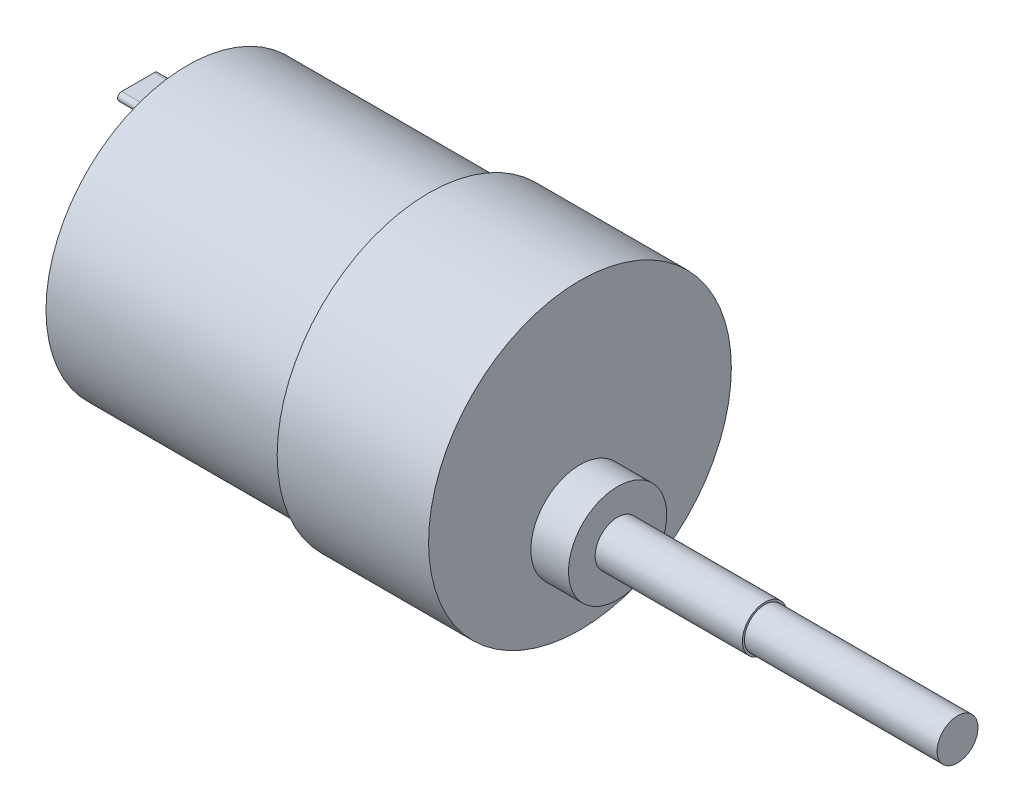
ISO-10303-21;
HEADER;
FILE_DESCRIPTION(('STEP AP214'),'2;1');
FILE_NAME('part.step','',(''),(''),'','','');
FILE_SCHEMA(('AUTOMOTIVE_DESIGN { 1 0 10303 214 1 1 1 1 }'));
ENDSEC;
DATA;
#1=APPLICATION_CONTEXT('core data for automotive mechanical design processes');
#2=APPLICATION_PROTOCOL_DEFINITION('international standard','automotive_design',2000,#1);
#3=PRODUCT_CONTEXT('',#1,'mechanical');
#4=PRODUCT('Part','Part','',(#3));
#5=PRODUCT_RELATED_PRODUCT_CATEGORY('part','',(#4));
#6=PRODUCT_DEFINITION_FORMATION('','',#4);
#7=PRODUCT_DEFINITION_CONTEXT('part definition',#1,'design');
#8=PRODUCT_DEFINITION('design','',#6,#7);
#9=PRODUCT_DEFINITION_SHAPE('','',#8);
#10=(LENGTH_UNIT() NAMED_UNIT(*) SI_UNIT(.MILLI.,.METRE.));
#11=(NAMED_UNIT(*) PLANE_ANGLE_UNIT() SI_UNIT($,.RADIAN.));
#12=(NAMED_UNIT(*) SI_UNIT($,.STERADIAN.) SOLID_ANGLE_UNIT());
#13=UNCERTAINTY_MEASURE_WITH_UNIT(LENGTH_MEASURE(1.E-05),#10,'distance_accuracy_value','');
#14=(GEOMETRIC_REPRESENTATION_CONTEXT(3) GLOBAL_UNCERTAINTY_ASSIGNED_CONTEXT((#13)) GLOBAL_UNIT_ASSIGNED_CONTEXT((#10,
#11,#12)) REPRESENTATION_CONTEXT('',''));
#15=CARTESIAN_POINT('',(0.,0.,0.));
#16=DIRECTION('',(0.,0.,1.));
#17=DIRECTION('',(1.,0.,0.));
#18=AXIS2_PLACEMENT_3D('',#15,#16,#17);
#19=CARTESIAN_POINT('',(0.,0.,0.));
#20=DIRECTION('',(1.,0.,0.));
#21=DIRECTION('',(0.,0.,-1.));
#22=AXIS2_PLACEMENT_3D('',#19,#20,#21);
#23=PLANE('',#22);
#24=CARTESIAN_POINT('',(0.,12.,-2.));
#25=DIRECTION('',(-1.,0.,0.));
#26=DIRECTION('',(0.,0.,1.));
#27=AXIS2_PLACEMENT_3D('',#24,#25,#26);
#28=CIRCLE('',#27,0.499999999999999);
#29=CARTESIAN_POINT('',(0.,12.5,-2.));
#30=VERTEX_POINT('',#29);
#31=CARTESIAN_POINT('',(0.,11.5,-2.));
#32=VERTEX_POINT('',#31);
#33=EDGE_CURVE('E128',#30,#32,#28,.T.);
#34=ORIENTED_EDGE('',*,*,#33,.F.);
#35=DIRECTION('',(0.,0.,-1.));
#36=VECTOR('',#35,1.);
#37=CARTESIAN_POINT('',(0.,12.5,-2.));
#38=LINE('',#37,#36);
#39=CARTESIAN_POINT('',(0.,12.5,2.));
#40=VERTEX_POINT('',#39);
#41=EDGE_CURVE('E171',#40,#30,#38,.T.);
#42=ORIENTED_EDGE('',*,*,#41,.F.);
#43=CARTESIAN_POINT('',(0.,12.,2.));
#44=DIRECTION('',(-1.,0.,0.));
#45=DIRECTION('',(0.,0.,1.));
#46=AXIS2_PLACEMENT_3D('',#43,#44,#45);
#47=CIRCLE('',#46,0.499999999999999);
#48=CARTESIAN_POINT('',(0.,11.5,2.));
#49=VERTEX_POINT('',#48);
#50=EDGE_CURVE('E188',#49,#40,#47,.T.);
#51=ORIENTED_EDGE('',*,*,#50,.F.);
#52=DIRECTION('',(0.,0.,1.));
#53=VECTOR('',#52,1.);
#54=CARTESIAN_POINT('',(0.,11.5,-2.));
#55=LINE('',#54,#53);
#56=EDGE_CURVE('E184',#32,#49,#55,.T.);
#57=ORIENTED_EDGE('',*,*,#56,.F.);
#58=EDGE_LOOP('',(#34,#42,#51,#57));
#59=FACE_BOUND('',#58,.T.);
#60=CARTESIAN_POINT('',(0.,0.,0.));
#61=DIRECTION('',(-1.,0.,0.));
#62=DIRECTION('',(0.,0.,1.));
#63=AXIS2_PLACEMENT_3D('',#60,#61,#62);
#64=CIRCLE('',#63,3.);
#65=CARTESIAN_POINT('',(0.,0.,3.));
#66=VERTEX_POINT('',#65);
#67=EDGE_CURVE('E219',#66,#66,#64,.T.);
#68=ORIENTED_EDGE('',*,*,#67,.F.);
#69=EDGE_LOOP('',(#68));
#70=FACE_BOUND('',#69,.T.);
#71=CARTESIAN_POINT('',(0.,0.,0.));
#72=DIRECTION('',(1.,0.,0.));
#73=DIRECTION('',(0.,0.,-1.));
#74=AXIS2_PLACEMENT_3D('',#71,#72,#73);
#75=CIRCLE('',#74,17.25);
#76=CARTESIAN_POINT('',(0.,0.,-17.25));
#77=VERTEX_POINT('',#76);
#78=EDGE_CURVE('E53',#77,#77,#75,.T.);
#79=ORIENTED_EDGE('',*,*,#78,.F.);
#80=EDGE_LOOP('',(#79));
#81=FACE_BOUND('',#80,.T.);
#82=CARTESIAN_POINT('',(0.,-12.,-2.));
#83=DIRECTION('',(-1.,0.,0.));
#84=DIRECTION('',(0.,0.,-1.));
#85=AXIS2_PLACEMENT_3D('',#82,#83,#84);
#86=CIRCLE('',#85,0.499999999999999);
#87=CARTESIAN_POINT('',(0.,-11.5,-2.));
#88=VERTEX_POINT('',#87);
#89=CARTESIAN_POINT('',(0.,-12.5,-2.));
#90=VERTEX_POINT('',#89);
#91=EDGE_CURVE('E121',#88,#90,#86,.T.);
#92=ORIENTED_EDGE('',*,*,#91,.F.);
#93=DIRECTION('',(0.,0.,-1.));
#94=VECTOR('',#93,1.);
#95=CARTESIAN_POINT('',(0.,-11.5,-2.));
#96=LINE('',#95,#94);
#97=CARTESIAN_POINT('',(0.,-11.5,2.));
#98=VERTEX_POINT('',#97);
#99=EDGE_CURVE('E123',#98,#88,#96,.T.);
#100=ORIENTED_EDGE('',*,*,#99,.F.);
#101=CARTESIAN_POINT('',(0.,-12.,2.));
#102=DIRECTION('',(-1.,0.,0.));
#103=DIRECTION('',(0.,0.,-1.));
#104=AXIS2_PLACEMENT_3D('',#101,#102,#103);
#105=CIRCLE('',#104,0.499999999999999);
#106=CARTESIAN_POINT('',(0.,-12.5,2.));
#107=VERTEX_POINT('',#106);
#108=EDGE_CURVE('E77',#107,#98,#105,.T.);
#109=ORIENTED_EDGE('',*,*,#108,.F.);
#110=DIRECTION('',(0.,0.,1.));
#111=VECTOR('',#110,1.);
#112=CARTESIAN_POINT('',(0.,-12.5,-2.));
#113=LINE('',#112,#111);
#114=EDGE_CURVE('E70',#90,#107,#113,.T.);
#115=ORIENTED_EDGE('',*,*,#114,.F.);
#116=EDGE_LOOP('',(#92,#100,#109,#115));
#117=FACE_BOUND('',#116,.T.);
#118=ADVANCED_FACE('F49',(#59,#70,#81,#117),#23,.F.);
#119=CARTESIAN_POINT('',(29.5,0.,0.));
#120=DIRECTION('',(-1.,0.,0.));
#121=DIRECTION('',(0.,0.,1.));
#122=AXIS2_PLACEMENT_3D('',#119,#120,#121);
#123=CYLINDRICAL_SURFACE('',#122,17.25);
#124=CARTESIAN_POINT('',(29.5,0.,0.));
#125=DIRECTION('',(1.,0.,0.));
#126=DIRECTION('',(0.,0.,-1.));
#127=AXIS2_PLACEMENT_3D('',#124,#125,#126);
#128=CIRCLE('',#127,17.25);
#129=CARTESIAN_POINT('',(29.5,0.,-17.25));
#130=VERTEX_POINT('',#129);
#131=EDGE_CURVE('E227',#130,#130,#128,.T.);
#132=ORIENTED_EDGE('',*,*,#131,.F.);
#133=EDGE_LOOP('',(#132));
#134=FACE_BOUND('',#133,.T.);
#135=ORIENTED_EDGE('',*,*,#78,.T.);
#136=EDGE_LOOP('',(#135));
#137=FACE_BOUND('',#136,.T.);
#138=ADVANCED_FACE('F51',(#134,#137),#123,.T.);
#139=CARTESIAN_POINT('',(48.,0.,0.));
#140=DIRECTION('',(-1.,0.,0.));
#141=DIRECTION('',(0.,0.,1.));
#142=AXIS2_PLACEMENT_3D('',#139,#140,#141);
#143=CYLINDRICAL_SURFACE('',#142,18.5);
#144=CARTESIAN_POINT('',(48.,0.,0.));
#145=DIRECTION('',(1.,0.,0.));
#146=DIRECTION('',(0.,0.,-1.));
#147=AXIS2_PLACEMENT_3D('',#144,#145,#146);
#148=CIRCLE('',#147,18.5);
#149=CARTESIAN_POINT('',(48.,0.,-18.5));
#150=VERTEX_POINT('',#149);
#151=EDGE_CURVE('E228',#150,#150,#148,.T.);
#152=ORIENTED_EDGE('',*,*,#151,.F.);
#153=EDGE_LOOP('',(#152));
#154=FACE_BOUND('',#153,.T.);
#155=CARTESIAN_POINT('',(29.5,0.,0.));
#156=DIRECTION('',(1.,0.,0.));
#157=DIRECTION('',(0.,0.,-1.));
#158=AXIS2_PLACEMENT_3D('',#155,#156,#157);
#159=CIRCLE('',#158,18.5);
#160=CARTESIAN_POINT('',(29.5,0.,-18.5));
#161=VERTEX_POINT('',#160);
#162=EDGE_CURVE('E223',#161,#161,#159,.T.);
#163=ORIENTED_EDGE('',*,*,#162,.T.);
#164=EDGE_LOOP('',(#163));
#165=FACE_BOUND('',#164,.T.);
#166=ADVANCED_FACE('F248',(#154,#165),#143,.T.);
#167=CARTESIAN_POINT('',(48.,0.,0.));
#168=DIRECTION('',(1.,0.,0.));
#169=DIRECTION('',(0.,0.,-1.));
#170=AXIS2_PLACEMENT_3D('',#167,#168,#169);
#171=PLANE('',#170);
#172=CARTESIAN_POINT('',(48.,-7.,0.));
#173=DIRECTION('',(1.,0.,0.));
#174=DIRECTION('',(0.,0.,-1.));
#175=AXIS2_PLACEMENT_3D('',#172,#173,#174);
#176=CIRCLE('',#175,6.);
#177=CARTESIAN_POINT('',(48.,-7.,-6.));
#178=VERTEX_POINT('',#177);
#179=EDGE_CURVE('E346',#178,#178,#176,.T.);
#180=ORIENTED_EDGE('',*,*,#179,.F.);
#181=EDGE_LOOP('',(#180));
#182=FACE_BOUND('',#181,.T.);
#183=ORIENTED_EDGE('',*,*,#151,.T.);
#184=EDGE_LOOP('',(#183));
#185=FACE_BOUND('',#184,.T.);
#186=ADVANCED_FACE('F253',(#182,#185),#171,.T.);
#187=CARTESIAN_POINT('',(29.5,0.,0.));
#188=DIRECTION('',(1.,0.,0.));
#189=DIRECTION('',(0.,0.,-1.));
#190=AXIS2_PLACEMENT_3D('',#187,#188,#189);
#191=PLANE('',#190);
#192=ORIENTED_EDGE('',*,*,#131,.T.);
#193=EDGE_LOOP('',(#192));
#194=FACE_BOUND('',#193,.T.);
#195=ORIENTED_EDGE('',*,*,#162,.F.);
#196=EDGE_LOOP('',(#195));
#197=FACE_BOUND('',#196,.T.);
#198=ADVANCED_FACE('F255',(#194,#197),#191,.F.);
#199=CARTESIAN_POINT('',(-1.5,0.,0.));
#200=DIRECTION('',(1.,0.,0.));
#201=DIRECTION('',(0.,0.,-1.));
#202=AXIS2_PLACEMENT_3D('',#199,#200,#201);
#203=CYLINDRICAL_SURFACE('',#202,3.);
#204=CARTESIAN_POINT('',(-1.5,0.,0.));
#205=DIRECTION('',(-1.,0.,0.));
#206=DIRECTION('',(0.,0.,1.));
#207=AXIS2_PLACEMENT_3D('',#204,#205,#206);
#208=CIRCLE('',#207,3.);
#209=CARTESIAN_POINT('',(-1.5,0.,3.));
#210=VERTEX_POINT('',#209);
#211=EDGE_CURVE('E214',#210,#210,#208,.T.);
#212=ORIENTED_EDGE('',*,*,#211,.F.);
#213=EDGE_LOOP('',(#212));
#214=FACE_BOUND('',#213,.T.);
#215=ORIENTED_EDGE('',*,*,#67,.T.);
#216=EDGE_LOOP('',(#215));
#217=FACE_BOUND('',#216,.T.);
#218=ADVANCED_FACE('F258',(#214,#217),#203,.T.);
#219=CARTESIAN_POINT('',(-1.5,0.,0.));
#220=DIRECTION('',(-1.,0.,0.));
#221=DIRECTION('',(0.,0.,1.));
#222=AXIS2_PLACEMENT_3D('',#219,#220,#221);
#223=PLANE('',#222);
#224=CARTESIAN_POINT('',(-1.5,0.,0.));
#225=DIRECTION('',(-1.,0.,0.));
#226=DIRECTION('',(0.,0.,1.));
#227=AXIS2_PLACEMENT_3D('',#224,#225,#226);
#228=CIRCLE('',#227,1.5);
#229=CARTESIAN_POINT('',(-1.5,0.,1.5));
#230=VERTEX_POINT('',#229);
#231=EDGE_CURVE('E215',#230,#230,#228,.T.);
#232=ORIENTED_EDGE('',*,*,#231,.F.);
#233=EDGE_LOOP('',(#232));
#234=FACE_BOUND('',#233,.T.);
#235=ORIENTED_EDGE('',*,*,#211,.T.);
#236=EDGE_LOOP('',(#235));
#237=FACE_BOUND('',#236,.T.);
#238=ADVANCED_FACE('F264',(#234,#237),#223,.T.);
#239=CARTESIAN_POINT('',(-3.,0.,0.));
#240=DIRECTION('',(1.,0.,0.));
#241=DIRECTION('',(0.,0.,-1.));
#242=AXIS2_PLACEMENT_3D('',#239,#240,#241);
#243=CYLINDRICAL_SURFACE('',#242,1.5);
#244=CARTESIAN_POINT('',(-3.,0.,0.));
#245=DIRECTION('',(-1.,0.,0.));
#246=DIRECTION('',(0.,0.,1.));
#247=AXIS2_PLACEMENT_3D('',#244,#245,#246);
#248=CIRCLE('',#247,1.5);
#249=CARTESIAN_POINT('',(-3.,0.,1.5));
#250=VERTEX_POINT('',#249);
#251=EDGE_CURVE('E210',#250,#250,#248,.T.);
#252=ORIENTED_EDGE('',*,*,#251,.F.);
#253=EDGE_LOOP('',(#252));
#254=FACE_BOUND('',#253,.T.);
#255=ORIENTED_EDGE('',*,*,#231,.T.);
#256=EDGE_LOOP('',(#255));
#257=FACE_BOUND('',#256,.T.);
#258=ADVANCED_FACE('F268',(#254,#257),#243,.T.);
#259=CARTESIAN_POINT('',(-3.,0.,0.));
#260=DIRECTION('',(-1.,0.,0.));
#261=DIRECTION('',(0.,0.,1.));
#262=AXIS2_PLACEMENT_3D('',#259,#260,#261);
#263=PLANE('',#262);
#264=ORIENTED_EDGE('',*,*,#251,.T.);
#265=EDGE_LOOP('',(#264));
#266=FACE_BOUND('',#265,.T.);
#267=ADVANCED_FACE('F272',(#266),#263,.T.);
#268=CARTESIAN_POINT('',(-6.,12.,-2.));
#269=DIRECTION('',(1.,0.,0.));
#270=DIRECTION('',(0.,0.,-1.));
#271=AXIS2_PLACEMENT_3D('',#268,#269,#270);
#272=CYLINDRICAL_SURFACE('',#271,0.499999999999999);
#273=ORIENTED_EDGE('',*,*,#33,.T.);
#274=DIRECTION('',(1.,0.,0.));
#275=VECTOR('',#274,1.);
#276=CARTESIAN_POINT('',(-6.,11.5,-2.));
#277=LINE('',#276,#275);
#278=CARTESIAN_POINT('',(-6.,11.5,-2.));
#279=VERTEX_POINT('',#278);
#280=EDGE_CURVE('E206',#279,#32,#277,.T.);
#281=ORIENTED_EDGE('',*,*,#280,.F.);
#282=CARTESIAN_POINT('',(-6.,12.,-2.));
#283=DIRECTION('',(-1.,0.,0.));
#284=DIRECTION('',(0.,0.,1.));
#285=AXIS2_PLACEMENT_3D('',#282,#283,#284);
#286=CIRCLE('',#285,0.499999999999999);
#287=CARTESIAN_POINT('',(-6.,12.5,-2.));
#288=VERTEX_POINT('',#287);
#289=EDGE_CURVE('E166',#288,#279,#286,.T.);
#290=ORIENTED_EDGE('',*,*,#289,.F.);
#291=DIRECTION('',(1.,0.,0.));
#292=VECTOR('',#291,1.);
#293=CARTESIAN_POINT('',(-6.,12.5,-2.));
#294=LINE('',#293,#292);
#295=EDGE_CURVE('E180',#288,#30,#294,.T.);
#296=ORIENTED_EDGE('',*,*,#295,.T.);
#297=EDGE_LOOP('',(#273,#281,#290,#296));
#298=FACE_BOUND('',#297,.T.);
#299=ADVANCED_FACE('F276',(#298),#272,.T.);
#300=CARTESIAN_POINT('',(-6.,11.5,-2.));
#301=DIRECTION('',(0.,1.,0.));
#302=DIRECTION('',(0.,0.,1.));
#303=AXIS2_PLACEMENT_3D('',#300,#301,#302);
#304=PLANE('',#303);
#305=ORIENTED_EDGE('',*,*,#56,.T.);
#306=DIRECTION('',(1.,0.,0.));
#307=VECTOR('',#306,1.);
#308=CARTESIAN_POINT('',(-6.,11.5,2.));
#309=LINE('',#308,#307);
#310=CARTESIAN_POINT('',(-6.,11.5,2.));
#311=VERTEX_POINT('',#310);
#312=EDGE_CURVE('E202',#311,#49,#309,.T.);
#313=ORIENTED_EDGE('',*,*,#312,.F.);
#314=DIRECTION('',(0.,0.,1.));
#315=VECTOR('',#314,1.);
#316=CARTESIAN_POINT('',(-6.,11.5,-2.));
#317=LINE('',#316,#315);
#318=EDGE_CURVE('E170',#279,#311,#317,.T.);
#319=ORIENTED_EDGE('',*,*,#318,.F.);
#320=ORIENTED_EDGE('',*,*,#280,.T.);
#321=EDGE_LOOP('',(#305,#313,#319,#320));
#322=FACE_BOUND('',#321,.T.);
#323=ADVANCED_FACE('F280',(#322),#304,.F.);
#324=CARTESIAN_POINT('',(-6.,12.,2.));
#325=DIRECTION('',(1.,0.,0.));
#326=DIRECTION('',(0.,0.,-1.));
#327=AXIS2_PLACEMENT_3D('',#324,#325,#326);
#328=CYLINDRICAL_SURFACE('',#327,0.499999999999999);
#329=ORIENTED_EDGE('',*,*,#50,.T.);
#330=DIRECTION('',(1.,0.,0.));
#331=VECTOR('',#330,1.);
#332=CARTESIAN_POINT('',(-6.,12.5,2.));
#333=LINE('',#332,#331);
#334=CARTESIAN_POINT('',(-6.,12.5,2.));
#335=VERTEX_POINT('',#334);
#336=EDGE_CURVE('E198',#335,#40,#333,.T.);
#337=ORIENTED_EDGE('',*,*,#336,.F.);
#338=CARTESIAN_POINT('',(-6.,12.,2.));
#339=DIRECTION('',(-1.,0.,0.));
#340=DIRECTION('',(0.,0.,1.));
#341=AXIS2_PLACEMENT_3D('',#338,#339,#340);
#342=CIRCLE('',#341,0.499999999999999);
#343=EDGE_CURVE('E174',#311,#335,#342,.T.);
#344=ORIENTED_EDGE('',*,*,#343,.F.);
#345=ORIENTED_EDGE('',*,*,#312,.T.);
#346=EDGE_LOOP('',(#329,#337,#344,#345));
#347=FACE_BOUND('',#346,.T.);
#348=ADVANCED_FACE('F284',(#347),#328,.T.);
#349=CARTESIAN_POINT('',(-6.,12.5,-2.));
#350=DIRECTION('',(0.,-1.,0.));
#351=DIRECTION('',(0.,0.,-1.));
#352=AXIS2_PLACEMENT_3D('',#349,#350,#351);
#353=PLANE('',#352);
#354=ORIENTED_EDGE('',*,*,#41,.T.);
#355=ORIENTED_EDGE('',*,*,#295,.F.);
#356=DIRECTION('',(0.,0.,-1.));
#357=VECTOR('',#356,1.);
#358=CARTESIAN_POINT('',(-6.,12.5,-2.));
#359=LINE('',#358,#357);
#360=EDGE_CURVE('E177',#335,#288,#359,.T.);
#361=ORIENTED_EDGE('',*,*,#360,.F.);
#362=ORIENTED_EDGE('',*,*,#336,.T.);
#363=EDGE_LOOP('',(#354,#355,#361,#362));
#364=FACE_BOUND('',#363,.T.);
#365=ADVANCED_FACE('F288',(#364),#353,.F.);
#366=CARTESIAN_POINT('',(-6.,12.,-2.));
#367=DIRECTION('',(-1.,0.,0.));
#368=DIRECTION('',(0.,0.,1.));
#369=AXIS2_PLACEMENT_3D('',#366,#367,#368);
#370=PLANE('',#369);
#371=ORIENTED_EDGE('',*,*,#289,.T.);
#372=ORIENTED_EDGE('',*,*,#318,.T.);
#373=ORIENTED_EDGE('',*,*,#343,.T.);
#374=ORIENTED_EDGE('',*,*,#360,.T.);
#375=EDGE_LOOP('',(#371,#372,#373,#374));
#376=FACE_BOUND('',#375,.T.);
#377=ADVANCED_FACE('F292',(#376),#370,.T.);
#378=CARTESIAN_POINT('',(-6.,-12.,-2.));
#379=DIRECTION('',(1.,0.,0.));
#380=DIRECTION('',(0.,0.,-1.));
#381=AXIS2_PLACEMENT_3D('',#378,#379,#380);
#382=CYLINDRICAL_SURFACE('',#381,0.499999999999999);
#383=ORIENTED_EDGE('',*,*,#91,.T.);
#384=DIRECTION('',(1.,0.,0.));
#385=VECTOR('',#384,1.);
#386=CARTESIAN_POINT('',(-6.,-12.5,-2.));
#387=LINE('',#386,#385);
#388=CARTESIAN_POINT('',(-6.,-12.5,-2.));
#389=VERTEX_POINT('',#388);
#390=EDGE_CURVE('E356',#389,#90,#387,.T.);
#391=ORIENTED_EDGE('',*,*,#390,.F.);
#392=CARTESIAN_POINT('',(-6.,-12.,-2.));
#393=DIRECTION('',(-1.,0.,0.));
#394=DIRECTION('',(0.,0.,-1.));
#395=AXIS2_PLACEMENT_3D('',#392,#393,#394);
#396=CIRCLE('',#395,0.499999999999999);
#397=CARTESIAN_POINT('',(-6.,-11.5,-2.));
#398=VERTEX_POINT('',#397);
#399=EDGE_CURVE('E140',#398,#389,#396,.T.);
#400=ORIENTED_EDGE('',*,*,#399,.F.);
#401=DIRECTION('',(1.,0.,0.));
#402=VECTOR('',#401,1.);
#403=CARTESIAN_POINT('',(-6.,-11.5,-2.));
#404=LINE('',#403,#402);
#405=EDGE_CURVE('E135',#398,#88,#404,.T.);
#406=ORIENTED_EDGE('',*,*,#405,.T.);
#407=EDGE_LOOP('',(#383,#391,#400,#406));
#408=FACE_BOUND('',#407,.T.);
#409=ADVANCED_FACE('F142',(#408),#382,.T.);
#410=CARTESIAN_POINT('',(-6.,-12.5,-2.));
#411=DIRECTION('',(0.,1.,0.));
#412=DIRECTION('',(0.,0.,1.));
#413=AXIS2_PLACEMENT_3D('',#410,#411,#412);
#414=PLANE('',#413);
#415=ORIENTED_EDGE('',*,*,#114,.T.);
#416=DIRECTION('',(1.,0.,0.));
#417=VECTOR('',#416,1.);
#418=CARTESIAN_POINT('',(-6.,-12.5,2.));
#419=LINE('',#418,#417);
#420=CARTESIAN_POINT('',(-6.,-12.5,2.));
#421=VERTEX_POINT('',#420);
#422=EDGE_CURVE('E151',#421,#107,#419,.T.);
#423=ORIENTED_EDGE('',*,*,#422,.F.);
#424=DIRECTION('',(0.,0.,1.));
#425=VECTOR('',#424,1.);
#426=CARTESIAN_POINT('',(-6.,-12.5,-2.));
#427=LINE('',#426,#425);
#428=EDGE_CURVE('E161',#389,#421,#427,.T.);
#429=ORIENTED_EDGE('',*,*,#428,.F.);
#430=ORIENTED_EDGE('',*,*,#390,.T.);
#431=EDGE_LOOP('',(#415,#423,#429,#430));
#432=FACE_BOUND('',#431,.T.);
#433=ADVANCED_FACE('F307',(#432),#414,.F.);
#434=CARTESIAN_POINT('',(-6.,-12.,2.));
#435=DIRECTION('',(1.,0.,0.));
#436=DIRECTION('',(0.,0.,-1.));
#437=AXIS2_PLACEMENT_3D('',#434,#435,#436);
#438=CYLINDRICAL_SURFACE('',#437,0.499999999999999);
#439=ORIENTED_EDGE('',*,*,#108,.T.);
#440=DIRECTION('',(1.,0.,0.));
#441=VECTOR('',#440,1.);
#442=CARTESIAN_POINT('',(-6.,-11.5,2.));
#443=LINE('',#442,#441);
#444=CARTESIAN_POINT('',(-6.,-11.5,2.));
#445=VERTEX_POINT('',#444);
#446=EDGE_CURVE('E138',#445,#98,#443,.T.);
#447=ORIENTED_EDGE('',*,*,#446,.F.);
#448=CARTESIAN_POINT('',(-6.,-12.,2.));
#449=DIRECTION('',(-1.,0.,0.));
#450=DIRECTION('',(0.,0.,-1.));
#451=AXIS2_PLACEMENT_3D('',#448,#449,#450);
#452=CIRCLE('',#451,0.499999999999999);
#453=EDGE_CURVE('E149',#421,#445,#452,.T.);
#454=ORIENTED_EDGE('',*,*,#453,.F.);
#455=ORIENTED_EDGE('',*,*,#422,.T.);
#456=EDGE_LOOP('',(#439,#447,#454,#455));
#457=FACE_BOUND('',#456,.T.);
#458=ADVANCED_FACE('F304',(#457),#438,.T.);
#459=CARTESIAN_POINT('',(-6.,-11.5,-2.));
#460=DIRECTION('',(0.,-1.,0.));
#461=DIRECTION('',(0.,0.,-1.));
#462=AXIS2_PLACEMENT_3D('',#459,#460,#461);
#463=PLANE('',#462);
#464=ORIENTED_EDGE('',*,*,#99,.T.);
#465=ORIENTED_EDGE('',*,*,#405,.F.);
#466=DIRECTION('',(0.,0.,-1.));
#467=VECTOR('',#466,1.);
#468=CARTESIAN_POINT('',(-6.,-11.5,-2.));
#469=LINE('',#468,#467);
#470=EDGE_CURVE('E145',#445,#398,#469,.T.);
#471=ORIENTED_EDGE('',*,*,#470,.F.);
#472=ORIENTED_EDGE('',*,*,#446,.T.);
#473=EDGE_LOOP('',(#464,#465,#471,#472));
#474=FACE_BOUND('',#473,.T.);
#475=ADVANCED_FACE('F133',(#474),#463,.F.);
#476=CARTESIAN_POINT('',(-6.,-12.,-2.));
#477=DIRECTION('',(1.,0.,0.));
#478=DIRECTION('',(0.,0.,-1.));
#479=AXIS2_PLACEMENT_3D('',#476,#477,#478);
#480=PLANE('',#479);
#481=ORIENTED_EDGE('',*,*,#399,.T.);
#482=ORIENTED_EDGE('',*,*,#428,.T.);
#483=ORIENTED_EDGE('',*,*,#453,.T.);
#484=ORIENTED_EDGE('',*,*,#470,.T.);
#485=EDGE_LOOP('',(#481,#482,#483,#484));
#486=FACE_BOUND('',#485,.T.);
#487=ADVANCED_FACE('F297',(#486),#480,.F.);
#488=CARTESIAN_POINT('',(52.6,-7.,0.));
#489=DIRECTION('',(-1.,0.,0.));
#490=DIRECTION('',(0.,0.,1.));
#491=AXIS2_PLACEMENT_3D('',#488,#489,#490);
#492=CYLINDRICAL_SURFACE('',#491,6.);
#493=CARTESIAN_POINT('',(52.6,-7.,0.));
#494=DIRECTION('',(1.,0.,0.));
#495=DIRECTION('',(0.,0.,-1.));
#496=AXIS2_PLACEMENT_3D('',#493,#494,#495);
#497=CIRCLE('',#496,6.);
#498=CARTESIAN_POINT('',(52.6,-7.,-6.));
#499=VERTEX_POINT('',#498);
#500=EDGE_CURVE('E352',#499,#499,#497,.T.);
#501=ORIENTED_EDGE('',*,*,#500,.F.);
#502=EDGE_LOOP('',(#501));
#503=FACE_BOUND('',#502,.T.);
#504=ORIENTED_EDGE('',*,*,#179,.T.);
#505=EDGE_LOOP('',(#504));
#506=FACE_BOUND('',#505,.T.);
#507=ADVANCED_FACE('F300',(#503,#506),#492,.T.);
#508=CARTESIAN_POINT('',(52.6,-7.,0.));
#509=DIRECTION('',(1.,0.,0.));
#510=DIRECTION('',(0.,0.,-1.));
#511=AXIS2_PLACEMENT_3D('',#508,#509,#510);
#512=PLANE('',#511);
#513=CARTESIAN_POINT('',(52.6,-7.,0.));
#514=DIRECTION('',(1.,0.,0.));
#515=DIRECTION('',(0.,0.,-1.));
#516=AXIS2_PLACEMENT_3D('',#513,#514,#515);
#517=CIRCLE('',#516,2.75);
#518=CARTESIAN_POINT('',(52.6,-7.,-2.75));
#519=VERTEX_POINT('',#518);
#520=EDGE_CURVE('E59',#519,#519,#517,.T.);
#521=ORIENTED_EDGE('',*,*,#520,.F.);
#522=EDGE_LOOP('',(#521));
#523=FACE_BOUND('',#522,.T.);
#524=ORIENTED_EDGE('',*,*,#500,.T.);
#525=EDGE_LOOP('',(#524));
#526=FACE_BOUND('',#525,.T.);
#527=ADVANCED_FACE('F316',(#523,#526),#512,.T.);
#528=CARTESIAN_POINT('',(70.6,-7.,0.));
#529=DIRECTION('',(-1.,0.,0.));
#530=DIRECTION('',(0.,0.,1.));
#531=AXIS2_PLACEMENT_3D('',#528,#529,#530);
#532=CYLINDRICAL_SURFACE('',#531,2.75);
#533=CARTESIAN_POINT('',(70.6,-7.,0.));
#534=DIRECTION('',(1.,0.,0.));
#535=DIRECTION('',(0.,0.,-1.));
#536=AXIS2_PLACEMENT_3D('',#533,#534,#535);
#537=CIRCLE('',#536,2.75);
#538=CARTESIAN_POINT('',(70.6,-7.,-2.75));
#539=VERTEX_POINT('',#538);
#540=EDGE_CURVE('E342',#539,#539,#537,.T.);
#541=ORIENTED_EDGE('',*,*,#540,.F.);
#542=EDGE_LOOP('',(#541));
#543=FACE_BOUND('',#542,.T.);
#544=ORIENTED_EDGE('',*,*,#520,.T.);
#545=EDGE_LOOP('',(#544));
#546=FACE_BOUND('',#545,.T.);
#547=ADVANCED_FACE('F320',(#543,#546),#532,.T.);
#548=CARTESIAN_POINT('',(70.6,-7.,0.));
#549=DIRECTION('',(1.,0.,0.));
#550=DIRECTION('',(0.,0.,-1.));
#551=AXIS2_PLACEMENT_3D('',#548,#549,#550);
#552=PLANE('',#551);
#553=CARTESIAN_POINT('',(70.6,-7.,0.));
#554=DIRECTION('',(1.,0.,0.));
#555=DIRECTION('',(0.,0.,-1.));
#556=AXIS2_PLACEMENT_3D('',#553,#554,#555);
#557=CIRCLE('',#556,2.5);
#558=CARTESIAN_POINT('',(70.6,-7.,-2.5));
#559=VERTEX_POINT('',#558);
#560=EDGE_CURVE('E11',#559,#559,#557,.T.);
#561=ORIENTED_EDGE('',*,*,#560,.F.);
#562=EDGE_LOOP('',(#561));
#563=FACE_BOUND('',#562,.T.);
#564=ORIENTED_EDGE('',*,*,#540,.T.);
#565=EDGE_LOOP('',(#564));
#566=FACE_BOUND('',#565,.T.);
#567=ADVANCED_FACE('F324',(#563,#566),#552,.T.);
#568=CARTESIAN_POINT('',(94.14,-7.,0.));
#569=DIRECTION('',(-1.,0.,0.));
#570=DIRECTION('',(0.,0.,1.));
#571=AXIS2_PLACEMENT_3D('',#568,#569,#570);
#572=CYLINDRICAL_SURFACE('',#571,2.5);
#573=CARTESIAN_POINT('',(94.14,-7.,0.));
#574=DIRECTION('',(1.,0.,0.));
#575=DIRECTION('',(0.,0.,-1.));
#576=AXIS2_PLACEMENT_3D('',#573,#574,#575);
#577=CIRCLE('',#576,2.5);
#578=CARTESIAN_POINT('',(94.14,-7.,-2.5));
#579=VERTEX_POINT('',#578);
#580=EDGE_CURVE('E340',#579,#579,#577,.T.);
#581=ORIENTED_EDGE('',*,*,#580,.F.);
#582=EDGE_LOOP('',(#581));
#583=FACE_BOUND('',#582,.T.);
#584=ORIENTED_EDGE('',*,*,#560,.T.);
#585=EDGE_LOOP('',(#584));
#586=FACE_BOUND('',#585,.T.);
#587=ADVANCED_FACE('F328',(#583,#586),#572,.T.);
#588=CARTESIAN_POINT('',(94.14,-7.,0.));
#589=DIRECTION('',(1.,0.,0.));
#590=DIRECTION('',(0.,0.,-1.));
#591=AXIS2_PLACEMENT_3D('',#588,#589,#590);
#592=PLANE('',#591);
#593=ORIENTED_EDGE('',*,*,#580,.T.);
#594=EDGE_LOOP('',(#593));
#595=FACE_BOUND('',#594,.T.);
#596=ADVANCED_FACE('F332',(#595),#592,.T.);
#597=CLOSED_SHELL('',(#118,#138,#166,#186,#198,#218,#238,#258,#267,#299,#323,#348,#365,#377,
#409,#433,#458,#475,#487,#507,#527,#547,#567,#587,#596));
#598=MANIFOLD_SOLID_BREP('B2',#597);
#599=ADVANCED_BREP_SHAPE_REPRESENTATION('',(#18,#598),#14);
#600=SHAPE_DEFINITION_REPRESENTATION(#9,#599);
ENDSEC;
END-ISO-10303-21;
